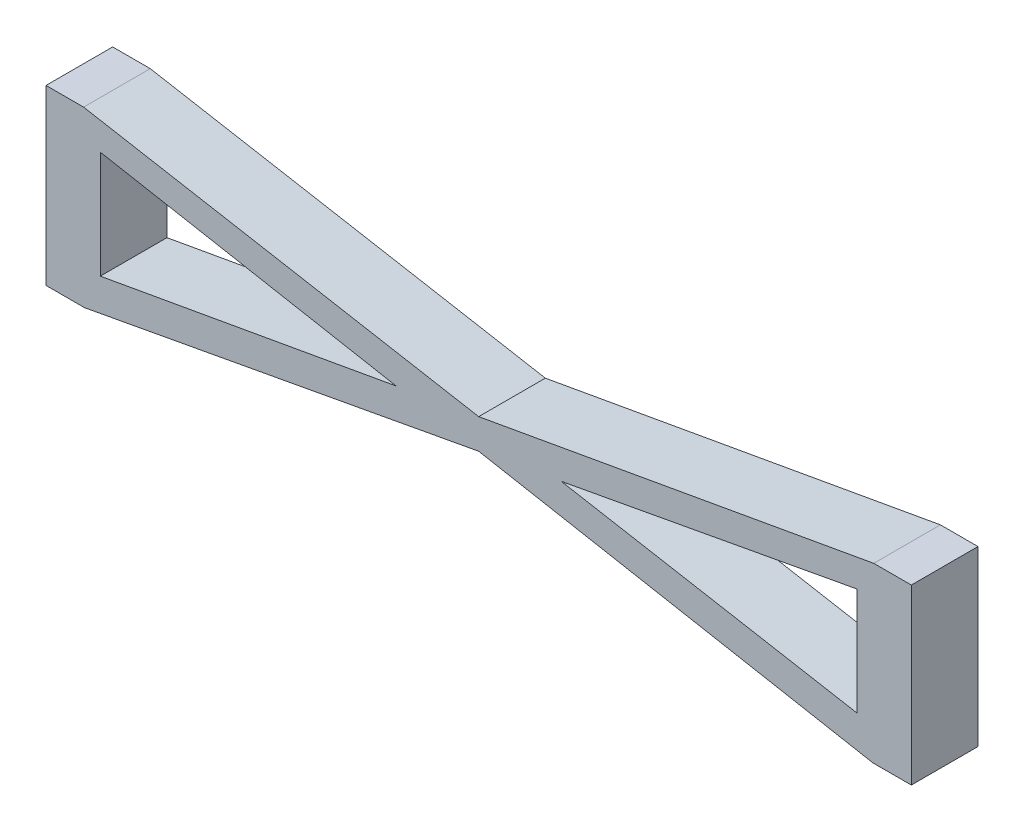
ISO-10303-21;
HEADER;
FILE_DESCRIPTION(('STEP AP214'),'2;1');
FILE_NAME('part.step','',(''),(''),'','','');
FILE_SCHEMA(('AUTOMOTIVE_DESIGN { 1 0 10303 214 1 1 1 1 }'));
ENDSEC;
DATA;
#1=APPLICATION_CONTEXT('core data for automotive mechanical design processes');
#2=APPLICATION_PROTOCOL_DEFINITION('international standard','automotive_design',2000,#1);
#3=PRODUCT_CONTEXT('',#1,'mechanical');
#4=PRODUCT('Part','Part','',(#3));
#5=PRODUCT_RELATED_PRODUCT_CATEGORY('part','',(#4));
#6=PRODUCT_DEFINITION_FORMATION('','',#4);
#7=PRODUCT_DEFINITION_CONTEXT('part definition',#1,'design');
#8=PRODUCT_DEFINITION('design','',#6,#7);
#9=PRODUCT_DEFINITION_SHAPE('','',#8);
#10=(LENGTH_UNIT() NAMED_UNIT(*) SI_UNIT(.MILLI.,.METRE.));
#11=(NAMED_UNIT(*) PLANE_ANGLE_UNIT() SI_UNIT($,.RADIAN.));
#12=(NAMED_UNIT(*) SI_UNIT($,.STERADIAN.) SOLID_ANGLE_UNIT());
#13=UNCERTAINTY_MEASURE_WITH_UNIT(LENGTH_MEASURE(1.E-05),#10,'distance_accuracy_value','');
#14=(GEOMETRIC_REPRESENTATION_CONTEXT(3) GLOBAL_UNCERTAINTY_ASSIGNED_CONTEXT((#13)) GLOBAL_UNIT_ASSIGNED_CONTEXT((#10,
#11,#12)) REPRESENTATION_CONTEXT('',''));
#15=CARTESIAN_POINT('',(0.,0.,0.));
#16=DIRECTION('',(0.,0.,1.));
#17=DIRECTION('',(1.,0.,0.));
#18=AXIS2_PLACEMENT_3D('',#15,#16,#17);
#19=CARTESIAN_POINT('',(0.,0.,19.0272625));
#20=DIRECTION('',(0.,0.,-1.));
#21=DIRECTION('',(-1.,0.,0.));
#22=AXIS2_PLACEMENT_3D('',#19,#20,#21);
#23=PLANE('',#22);
#24=DIRECTION('',(0.984447907206048,0.175676742904779,0.));
#25=VECTOR('',#24,1.);
#26=CARTESIAN_POINT('',(99.9298920153493,25.1202753574179,19.0272625));
#27=LINE('',#26,#25);
#28=CARTESIAN_POINT('',(15.5,10.0535884108689,19.0272625));
#29=VERTEX_POINT('',#28);
#30=CARTESIAN_POINT('',(99.9298920153493,25.1202753574179,19.0272625));
#31=VERTEX_POINT('',#30);
#32=EDGE_CURVE('E173',#29,#31,#27,.T.);
#33=ORIENTED_EDGE('',*,*,#32,.F.);
#34=DIRECTION('',(0.,-1.,0.));
#35=VECTOR('',#34,1.);
#36=CARTESIAN_POINT('',(15.5,10.0535884108689,19.0272625));
#37=LINE('',#36,#35);
#38=CARTESIAN_POINT('',(15.5,40.7056712671806,19.0272625));
#39=VERTEX_POINT('',#38);
#40=EDGE_CURVE('E179',#39,#29,#37,.T.);
#41=ORIENTED_EDGE('',*,*,#40,.F.);
#42=DIRECTION('',(-0.98338563427124,0.181528769920777,0.));
#43=VECTOR('',#42,1.);
#44=CARTESIAN_POINT('',(15.5,40.7056712671806,19.0272625));
#45=LINE('',#44,#43);
#46=EDGE_CURVE('E175',#31,#39,#45,.T.);
#47=ORIENTED_EDGE('',*,*,#46,.F.);
#48=EDGE_LOOP('',(#33,#41,#47));
#49=FACE_BOUND('',#48,.T.);
#50=DIRECTION('',(0.,-1.,0.));
#51=VECTOR('',#50,1.);
#52=CARTESIAN_POINT('',(0.,0.,19.0272625));
#53=LINE('',#52,#51);
#54=CARTESIAN_POINT('',(0.,49.45,19.0272625));
#55=VERTEX_POINT('',#54);
#56=CARTESIAN_POINT('',(0.,0.,19.0272625));
#57=VERTEX_POINT('',#56);
#58=EDGE_CURVE('E197',#55,#57,#53,.T.);
#59=ORIENTED_EDGE('',*,*,#58,.T.);
#60=DIRECTION('',(1.,0.,0.));
#61=VECTOR('',#60,1.);
#62=CARTESIAN_POINT('',(0.,0.,19.0272625));
#63=LINE('',#62,#61);
#64=CARTESIAN_POINT('',(10.9854067749023,0.,19.0272625));
#65=VERTEX_POINT('',#64);
#66=EDGE_CURVE('E200',#57,#65,#63,.T.);
#67=ORIENTED_EDGE('',*,*,#66,.T.);
#68=DIRECTION('',(0.98338563427124,0.181528769920777,0.));
#69=VECTOR('',#68,1.);
#70=CARTESIAN_POINT('',(123.4989795,20.7695229057467,19.0272625));
#71=LINE('',#70,#69);
#72=CARTESIAN_POINT('',(123.4989795,20.7695229057467,19.0272625));
#73=VERTEX_POINT('',#72);
#74=EDGE_CURVE('E203',#65,#73,#71,.T.);
#75=ORIENTED_EDGE('',*,*,#74,.T.);
#76=DIRECTION('',(0.98338563427124,-0.181528769920776,0.));
#77=VECTOR('',#76,1.);
#78=CARTESIAN_POINT('',(123.4989795,20.7695229057467,19.0272625));
#79=LINE('',#78,#77);
#80=CARTESIAN_POINT('',(236.012552225098,0.,19.0272625));
#81=VERTEX_POINT('',#80);
#82=EDGE_CURVE('E205',#73,#81,#79,.T.);
#83=ORIENTED_EDGE('',*,*,#82,.T.);
#84=DIRECTION('',(1.,0.,0.));
#85=VECTOR('',#84,1.);
#86=CARTESIAN_POINT('',(236.012552225098,0.,19.0272625));
#87=LINE('',#86,#85);
#88=CARTESIAN_POINT('',(246.997959,0.,19.0272625));
#89=VERTEX_POINT('',#88);
#90=EDGE_CURVE('E207',#81,#89,#87,.T.);
#91=ORIENTED_EDGE('',*,*,#90,.T.);
#92=DIRECTION('',(0.,1.,0.));
#93=VECTOR('',#92,1.);
#94=CARTESIAN_POINT('',(246.997959,0.,19.0272625));
#95=LINE('',#94,#93);
#96=CARTESIAN_POINT('',(246.997959,49.45,19.0272625));
#97=VERTEX_POINT('',#96);
#98=EDGE_CURVE('E209',#89,#97,#95,.T.);
#99=ORIENTED_EDGE('',*,*,#98,.T.);
#100=DIRECTION('',(-1.,0.,0.));
#101=VECTOR('',#100,1.);
#102=CARTESIAN_POINT('',(236.267497729452,49.45,19.0272625));
#103=LINE('',#102,#101);
#104=CARTESIAN_POINT('',(236.267497729452,49.45,19.0272625));
#105=VERTEX_POINT('',#104);
#106=EDGE_CURVE('E211',#97,#105,#103,.T.);
#107=ORIENTED_EDGE('',*,*,#106,.T.);
#108=DIRECTION('',(-0.984447907206048,-0.175676742904779,0.));
#109=VECTOR('',#108,1.);
#110=CARTESIAN_POINT('',(236.267497729452,49.45,19.0272625));
#111=LINE('',#110,#109);
#112=CARTESIAN_POINT('',(123.4989795,29.3262272338279,19.0272625));
#113=VERTEX_POINT('',#112);
#114=EDGE_CURVE('E213',#105,#113,#111,.T.);
#115=ORIENTED_EDGE('',*,*,#114,.T.);
#116=DIRECTION('',(-0.984447907206048,0.175676742904778,0.));
#117=VECTOR('',#116,1.);
#118=CARTESIAN_POINT('',(10.7304612705484,49.45,19.0272625));
#119=LINE('',#118,#117);
#120=CARTESIAN_POINT('',(10.7304612705484,49.45,19.0272625));
#121=VERTEX_POINT('',#120);
#122=EDGE_CURVE('E215',#113,#121,#119,.T.);
#123=ORIENTED_EDGE('',*,*,#122,.T.);
#124=DIRECTION('',(-1.,0.,0.));
#125=VECTOR('',#124,1.);
#126=CARTESIAN_POINT('',(0.,49.45,19.0272625));
#127=LINE('',#126,#125);
#128=EDGE_CURVE('E217',#121,#55,#127,.T.);
#129=ORIENTED_EDGE('',*,*,#128,.T.);
#130=EDGE_LOOP('',(#59,#67,#75,#83,#91,#99,#107,#115,#123,#129));
#131=FACE_BOUND('',#130,.T.);
#132=DIRECTION('',(0.984447907206048,-0.175676742904778,0.));
#133=VECTOR('',#132,1.);
#134=CARTESIAN_POINT('',(147.06806698465,25.1202753574179,19.0272625));
#135=LINE('',#134,#133);
#136=CARTESIAN_POINT('',(147.06806698465,25.1202753574179,19.0272625));
#137=VERTEX_POINT('',#136);
#138=CARTESIAN_POINT('',(231.497959,10.0535884108689,19.0272625));
#139=VERTEX_POINT('',#138);
#140=EDGE_CURVE('E146',#137,#139,#135,.T.);
#141=ORIENTED_EDGE('',*,*,#140,.F.);
#142=DIRECTION('',(-0.983385634271241,-0.181528769920776,0.));
#143=VECTOR('',#142,1.);
#144=CARTESIAN_POINT('',(231.497959,40.7056712671806,19.0272625));
#145=LINE('',#144,#143);
#146=CARTESIAN_POINT('',(231.497959,40.7056712671806,19.0272625));
#147=VERTEX_POINT('',#146);
#148=EDGE_CURVE('E163',#147,#137,#145,.T.);
#149=ORIENTED_EDGE('',*,*,#148,.F.);
#150=DIRECTION('',(0.,1.,0.));
#151=VECTOR('',#150,1.);
#152=CARTESIAN_POINT('',(231.497959,10.0535884108689,19.0272625));
#153=LINE('',#152,#151);
#154=EDGE_CURVE('E154',#139,#147,#153,.T.);
#155=ORIENTED_EDGE('',*,*,#154,.F.);
#156=EDGE_LOOP('',(#141,#149,#155));
#157=FACE_BOUND('',#156,.T.);
#158=ADVANCED_FACE('F33',(#49,#131,#157),#23,.F.);
#159=CARTESIAN_POINT('',(0.,0.,0.));
#160=DIRECTION('',(0.,0.,-1.));
#161=DIRECTION('',(-1.,0.,0.));
#162=AXIS2_PLACEMENT_3D('',#159,#160,#161);
#163=PLANE('',#162);
#164=DIRECTION('',(0.,-1.,0.));
#165=VECTOR('',#164,1.);
#166=CARTESIAN_POINT('',(0.,0.,0.));
#167=LINE('',#166,#165);
#168=CARTESIAN_POINT('',(0.,49.45,0.));
#169=VERTEX_POINT('',#168);
#170=CARTESIAN_POINT('',(0.,0.,0.));
#171=VERTEX_POINT('',#170);
#172=EDGE_CURVE('E196',#169,#171,#167,.T.);
#173=ORIENTED_EDGE('',*,*,#172,.F.);
#174=DIRECTION('',(-1.,0.,0.));
#175=VECTOR('',#174,1.);
#176=CARTESIAN_POINT('',(0.,49.45,0.));
#177=LINE('',#176,#175);
#178=CARTESIAN_POINT('',(10.7304612705484,49.45,0.));
#179=VERTEX_POINT('',#178);
#180=EDGE_CURVE('E201',#179,#169,#177,.T.);
#181=ORIENTED_EDGE('',*,*,#180,.F.);
#182=DIRECTION('',(-0.984447907206048,0.175676742904778,0.));
#183=VECTOR('',#182,1.);
#184=CARTESIAN_POINT('',(10.7304612705484,49.45,0.));
#185=LINE('',#184,#183);
#186=CARTESIAN_POINT('',(123.4989795,29.3262272338279,0.));
#187=VERTEX_POINT('',#186);
#188=EDGE_CURVE('E236',#187,#179,#185,.T.);
#189=ORIENTED_EDGE('',*,*,#188,.F.);
#190=DIRECTION('',(-0.984447907206048,-0.175676742904779,0.));
#191=VECTOR('',#190,1.);
#192=CARTESIAN_POINT('',(236.267497729452,49.45,0.));
#193=LINE('',#192,#191);
#194=CARTESIAN_POINT('',(236.267497729452,49.45,0.));
#195=VERTEX_POINT('',#194);
#196=EDGE_CURVE('E234',#195,#187,#193,.T.);
#197=ORIENTED_EDGE('',*,*,#196,.F.);
#198=DIRECTION('',(-1.,0.,0.));
#199=VECTOR('',#198,1.);
#200=CARTESIAN_POINT('',(236.267497729452,49.45,0.));
#201=LINE('',#200,#199);
#202=CARTESIAN_POINT('',(246.997959,49.45,0.));
#203=VERTEX_POINT('',#202);
#204=EDGE_CURVE('E232',#203,#195,#201,.T.);
#205=ORIENTED_EDGE('',*,*,#204,.F.);
#206=DIRECTION('',(0.,1.,0.));
#207=VECTOR('',#206,1.);
#208=CARTESIAN_POINT('',(246.997959,0.,0.));
#209=LINE('',#208,#207);
#210=CARTESIAN_POINT('',(246.997959,0.,0.));
#211=VERTEX_POINT('',#210);
#212=EDGE_CURVE('E230',#211,#203,#209,.T.);
#213=ORIENTED_EDGE('',*,*,#212,.F.);
#214=DIRECTION('',(1.,0.,0.));
#215=VECTOR('',#214,1.);
#216=CARTESIAN_POINT('',(236.012552225098,0.,0.));
#217=LINE('',#216,#215);
#218=CARTESIAN_POINT('',(236.012552225098,0.,0.));
#219=VERTEX_POINT('',#218);
#220=EDGE_CURVE('E228',#219,#211,#217,.T.);
#221=ORIENTED_EDGE('',*,*,#220,.F.);
#222=DIRECTION('',(0.98338563427124,-0.181528769920776,0.));
#223=VECTOR('',#222,1.);
#224=CARTESIAN_POINT('',(123.4989795,20.7695229057467,0.));
#225=LINE('',#224,#223);
#226=CARTESIAN_POINT('',(123.4989795,20.7695229057467,0.));
#227=VERTEX_POINT('',#226);
#228=EDGE_CURVE('E226',#227,#219,#225,.T.);
#229=ORIENTED_EDGE('',*,*,#228,.F.);
#230=DIRECTION('',(0.98338563427124,0.181528769920777,0.));
#231=VECTOR('',#230,1.);
#232=CARTESIAN_POINT('',(123.4989795,20.7695229057467,0.));
#233=LINE('',#232,#231);
#234=CARTESIAN_POINT('',(10.9854067749023,0.,0.));
#235=VERTEX_POINT('',#234);
#236=EDGE_CURVE('E224',#235,#227,#233,.T.);
#237=ORIENTED_EDGE('',*,*,#236,.F.);
#238=DIRECTION('',(1.,0.,0.));
#239=VECTOR('',#238,1.);
#240=CARTESIAN_POINT('',(0.,0.,0.));
#241=LINE('',#240,#239);
#242=EDGE_CURVE('E222',#171,#235,#241,.T.);
#243=ORIENTED_EDGE('',*,*,#242,.F.);
#244=EDGE_LOOP('',(#173,#181,#189,#197,#205,#213,#221,#229,#237,#243));
#245=FACE_BOUND('',#244,.T.);
#246=DIRECTION('',(0.,-1.,0.));
#247=VECTOR('',#246,1.);
#248=CARTESIAN_POINT('',(15.5,10.0535884108689,0.));
#249=LINE('',#248,#247);
#250=CARTESIAN_POINT('',(15.5,40.7056712671806,0.));
#251=VERTEX_POINT('',#250);
#252=CARTESIAN_POINT('',(15.5,10.0535884108689,0.));
#253=VERTEX_POINT('',#252);
#254=EDGE_CURVE('E176',#251,#253,#249,.T.);
#255=ORIENTED_EDGE('',*,*,#254,.T.);
#256=DIRECTION('',(0.984447907206048,0.175676742904779,0.));
#257=VECTOR('',#256,1.);
#258=CARTESIAN_POINT('',(99.9298920153493,25.1202753574179,0.));
#259=LINE('',#258,#257);
#260=CARTESIAN_POINT('',(99.9298920153493,25.1202753574179,0.));
#261=VERTEX_POINT('',#260);
#262=EDGE_CURVE('E161',#253,#261,#259,.T.);
#263=ORIENTED_EDGE('',*,*,#262,.T.);
#264=DIRECTION('',(-0.98338563427124,0.181528769920777,0.));
#265=VECTOR('',#264,1.);
#266=CARTESIAN_POINT('',(15.5,40.7056712671806,0.));
#267=LINE('',#266,#265);
#268=EDGE_CURVE('E184',#261,#251,#267,.T.);
#269=ORIENTED_EDGE('',*,*,#268,.T.);
#270=EDGE_LOOP('',(#255,#263,#269));
#271=FACE_BOUND('',#270,.T.);
#272=DIRECTION('',(-0.983385634271241,-0.181528769920776,0.));
#273=VECTOR('',#272,1.);
#274=CARTESIAN_POINT('',(231.497959,40.7056712671806,0.));
#275=LINE('',#274,#273);
#276=CARTESIAN_POINT('',(231.497959,40.7056712671806,0.));
#277=VERTEX_POINT('',#276);
#278=CARTESIAN_POINT('',(147.06806698465,25.1202753574179,0.));
#279=VERTEX_POINT('',#278);
#280=EDGE_CURVE('E155',#277,#279,#275,.T.);
#281=ORIENTED_EDGE('',*,*,#280,.T.);
#282=DIRECTION('',(0.984447907206048,-0.175676742904778,0.));
#283=VECTOR('',#282,1.);
#284=CARTESIAN_POINT('',(147.06806698465,25.1202753574179,0.));
#285=LINE('',#284,#283);
#286=CARTESIAN_POINT('',(231.497959,10.0535884108689,0.));
#287=VERTEX_POINT('',#286);
#288=EDGE_CURVE('E56',#279,#287,#285,.T.);
#289=ORIENTED_EDGE('',*,*,#288,.T.);
#290=DIRECTION('',(0.,1.,0.));
#291=VECTOR('',#290,1.);
#292=CARTESIAN_POINT('',(231.497959,10.0535884108689,0.));
#293=LINE('',#292,#291);
#294=EDGE_CURVE('E160',#287,#277,#293,.T.);
#295=ORIENTED_EDGE('',*,*,#294,.T.);
#296=EDGE_LOOP('',(#281,#289,#295));
#297=FACE_BOUND('',#296,.T.);
#298=ADVANCED_FACE('F272',(#245,#271,#297),#163,.T.);
#299=CARTESIAN_POINT('',(0.,0.,19.0272625));
#300=DIRECTION('',(1.,0.,0.));
#301=DIRECTION('',(0.,0.,-1.));
#302=AXIS2_PLACEMENT_3D('',#299,#300,#301);
#303=PLANE('',#302);
#304=ORIENTED_EDGE('',*,*,#172,.T.);
#305=DIRECTION('',(0.,0.,-1.));
#306=VECTOR('',#305,1.);
#307=CARTESIAN_POINT('',(0.,0.,19.0272625));
#308=LINE('',#307,#306);
#309=EDGE_CURVE('E11',#57,#171,#308,.T.);
#310=ORIENTED_EDGE('',*,*,#309,.F.);
#311=ORIENTED_EDGE('',*,*,#58,.F.);
#312=DIRECTION('',(0.,0.,-1.));
#313=VECTOR('',#312,1.);
#314=CARTESIAN_POINT('',(0.,49.45,19.0272625));
#315=LINE('',#314,#313);
#316=EDGE_CURVE('E219',#55,#169,#315,.T.);
#317=ORIENTED_EDGE('',*,*,#316,.T.);
#318=EDGE_LOOP('',(#304,#310,#311,#317));
#319=FACE_BOUND('',#318,.T.);
#320=ADVANCED_FACE('F35',(#319),#303,.F.);
#321=CARTESIAN_POINT('',(0.,0.,19.0272625));
#322=DIRECTION('',(0.,1.,0.));
#323=DIRECTION('',(0.,0.,1.));
#324=AXIS2_PLACEMENT_3D('',#321,#322,#323);
#325=PLANE('',#324);
#326=ORIENTED_EDGE('',*,*,#242,.T.);
#327=DIRECTION('',(0.,0.,-1.));
#328=VECTOR('',#327,1.);
#329=CARTESIAN_POINT('',(10.9854067749023,0.,19.0272625));
#330=LINE('',#329,#328);
#331=EDGE_CURVE('E41',#65,#235,#330,.T.);
#332=ORIENTED_EDGE('',*,*,#331,.F.);
#333=ORIENTED_EDGE('',*,*,#66,.F.);
#334=ORIENTED_EDGE('',*,*,#309,.T.);
#335=EDGE_LOOP('',(#326,#332,#333,#334));
#336=FACE_BOUND('',#335,.T.);
#337=ADVANCED_FACE('F289',(#336),#325,.F.);
#338=CARTESIAN_POINT('',(123.4989795,20.7695229057467,19.0272625));
#339=DIRECTION('',(-0.181528769920777,0.98338563427124,0.));
#340=DIRECTION('',(-0.98338563427124,-0.181528769920777,0.));
#341=AXIS2_PLACEMENT_3D('',#338,#339,#340);
#342=PLANE('',#341);
#343=ORIENTED_EDGE('',*,*,#236,.T.);
#344=DIRECTION('',(0.,0.,-1.));
#345=VECTOR('',#344,1.);
#346=CARTESIAN_POINT('',(123.4989795,20.7695229057467,19.0272625));
#347=LINE('',#346,#345);
#348=EDGE_CURVE('E259',#73,#227,#347,.T.);
#349=ORIENTED_EDGE('',*,*,#348,.F.);
#350=ORIENTED_EDGE('',*,*,#74,.F.);
#351=ORIENTED_EDGE('',*,*,#331,.T.);
#352=EDGE_LOOP('',(#343,#349,#350,#351));
#353=FACE_BOUND('',#352,.T.);
#354=ADVANCED_FACE('F266',(#353),#342,.F.);
#355=CARTESIAN_POINT('',(123.4989795,20.7695229057467,19.0272625));
#356=DIRECTION('',(0.181528769920776,0.98338563427124,0.));
#357=DIRECTION('',(-0.983385634271241,0.181528769920776,0.));
#358=AXIS2_PLACEMENT_3D('',#355,#356,#357);
#359=PLANE('',#358);
#360=ORIENTED_EDGE('',*,*,#228,.T.);
#361=DIRECTION('',(0.,0.,-1.));
#362=VECTOR('',#361,1.);
#363=CARTESIAN_POINT('',(236.012552225098,0.,19.0272625));
#364=LINE('',#363,#362);
#365=EDGE_CURVE('E256',#81,#219,#364,.T.);
#366=ORIENTED_EDGE('',*,*,#365,.F.);
#367=ORIENTED_EDGE('',*,*,#82,.F.);
#368=ORIENTED_EDGE('',*,*,#348,.T.);
#369=EDGE_LOOP('',(#360,#366,#367,#368));
#370=FACE_BOUND('',#369,.T.);
#371=ADVANCED_FACE('F278',(#370),#359,.F.);
#372=CARTESIAN_POINT('',(236.012552225098,0.,19.0272625));
#373=DIRECTION('',(0.,1.,0.));
#374=DIRECTION('',(0.,0.,1.));
#375=AXIS2_PLACEMENT_3D('',#372,#373,#374);
#376=PLANE('',#375);
#377=ORIENTED_EDGE('',*,*,#220,.T.);
#378=DIRECTION('',(0.,0.,-1.));
#379=VECTOR('',#378,1.);
#380=CARTESIAN_POINT('',(246.997959,0.,19.0272625));
#381=LINE('',#380,#379);
#382=EDGE_CURVE('E253',#89,#211,#381,.T.);
#383=ORIENTED_EDGE('',*,*,#382,.F.);
#384=ORIENTED_EDGE('',*,*,#90,.F.);
#385=ORIENTED_EDGE('',*,*,#365,.T.);
#386=EDGE_LOOP('',(#377,#383,#384,#385));
#387=FACE_BOUND('',#386,.T.);
#388=ADVANCED_FACE('F282',(#387),#376,.F.);
#389=CARTESIAN_POINT('',(246.997959,0.,19.0272625));
#390=DIRECTION('',(-1.,0.,0.));
#391=DIRECTION('',(0.,0.,1.));
#392=AXIS2_PLACEMENT_3D('',#389,#390,#391);
#393=PLANE('',#392);
#394=ORIENTED_EDGE('',*,*,#212,.T.);
#395=DIRECTION('',(0.,0.,-1.));
#396=VECTOR('',#395,1.);
#397=CARTESIAN_POINT('',(246.997959,49.45,19.0272625));
#398=LINE('',#397,#396);
#399=EDGE_CURVE('E250',#97,#203,#398,.T.);
#400=ORIENTED_EDGE('',*,*,#399,.F.);
#401=ORIENTED_EDGE('',*,*,#98,.F.);
#402=ORIENTED_EDGE('',*,*,#382,.T.);
#403=EDGE_LOOP('',(#394,#400,#401,#402));
#404=FACE_BOUND('',#403,.T.);
#405=ADVANCED_FACE('F312',(#404),#393,.F.);
#406=CARTESIAN_POINT('',(236.267497729452,49.45,19.0272625));
#407=DIRECTION('',(0.,-1.,0.));
#408=DIRECTION('',(0.,0.,-1.));
#409=AXIS2_PLACEMENT_3D('',#406,#407,#408);
#410=PLANE('',#409);
#411=ORIENTED_EDGE('',*,*,#204,.T.);
#412=DIRECTION('',(0.,0.,-1.));
#413=VECTOR('',#412,1.);
#414=CARTESIAN_POINT('',(236.267497729452,49.45,19.0272625));
#415=LINE('',#414,#413);
#416=EDGE_CURVE('E247',#105,#195,#415,.T.);
#417=ORIENTED_EDGE('',*,*,#416,.F.);
#418=ORIENTED_EDGE('',*,*,#106,.F.);
#419=ORIENTED_EDGE('',*,*,#399,.T.);
#420=EDGE_LOOP('',(#411,#417,#418,#419));
#421=FACE_BOUND('',#420,.T.);
#422=ADVANCED_FACE('F309',(#421),#410,.F.);
#423=CARTESIAN_POINT('',(236.267497729452,49.45,19.0272625));
#424=DIRECTION('',(0.175676742904779,-0.984447907206048,0.));
#425=DIRECTION('',(0.984447907206048,0.175676742904779,0.));
#426=AXIS2_PLACEMENT_3D('',#423,#424,#425);
#427=PLANE('',#426);
#428=ORIENTED_EDGE('',*,*,#196,.T.);
#429=DIRECTION('',(0.,0.,-1.));
#430=VECTOR('',#429,1.);
#431=CARTESIAN_POINT('',(123.4989795,29.3262272338279,19.0272625));
#432=LINE('',#431,#430);
#433=EDGE_CURVE('E244',#113,#187,#432,.T.);
#434=ORIENTED_EDGE('',*,*,#433,.F.);
#435=ORIENTED_EDGE('',*,*,#114,.F.);
#436=ORIENTED_EDGE('',*,*,#416,.T.);
#437=EDGE_LOOP('',(#428,#434,#435,#436));
#438=FACE_BOUND('',#437,.T.);
#439=ADVANCED_FACE('F305',(#438),#427,.F.);
#440=CARTESIAN_POINT('',(10.7304612705484,49.45,19.0272625));
#441=DIRECTION('',(-0.175676742904778,-0.984447907206048,0.));
#442=DIRECTION('',(0.984447907206049,-0.175676742904778,0.));
#443=AXIS2_PLACEMENT_3D('',#440,#441,#442);
#444=PLANE('',#443);
#445=ORIENTED_EDGE('',*,*,#188,.T.);
#446=DIRECTION('',(0.,0.,-1.));
#447=VECTOR('',#446,1.);
#448=CARTESIAN_POINT('',(10.7304612705484,49.45,19.0272625));
#449=LINE('',#448,#447);
#450=EDGE_CURVE('E241',#121,#179,#449,.T.);
#451=ORIENTED_EDGE('',*,*,#450,.F.);
#452=ORIENTED_EDGE('',*,*,#122,.F.);
#453=ORIENTED_EDGE('',*,*,#433,.T.);
#454=EDGE_LOOP('',(#445,#451,#452,#453));
#455=FACE_BOUND('',#454,.T.);
#456=ADVANCED_FACE('F301',(#455),#444,.F.);
#457=CARTESIAN_POINT('',(0.,49.45,19.0272625));
#458=DIRECTION('',(0.,-1.,0.));
#459=DIRECTION('',(0.,0.,-1.));
#460=AXIS2_PLACEMENT_3D('',#457,#458,#459);
#461=PLANE('',#460);
#462=ORIENTED_EDGE('',*,*,#180,.T.);
#463=ORIENTED_EDGE('',*,*,#316,.F.);
#464=ORIENTED_EDGE('',*,*,#128,.F.);
#465=ORIENTED_EDGE('',*,*,#450,.T.);
#466=EDGE_LOOP('',(#462,#463,#464,#465));
#467=FACE_BOUND('',#466,.T.);
#468=ADVANCED_FACE('F296',(#467),#461,.F.);
#469=CARTESIAN_POINT('',(99.9298920153493,25.1202753574179,19.0272625));
#470=DIRECTION('',(-0.175676742904779,0.984447907206048,0.));
#471=DIRECTION('',(-0.984447907206048,-0.175676742904779,0.));
#472=AXIS2_PLACEMENT_3D('',#469,#470,#471);
#473=PLANE('',#472);
#474=ORIENTED_EDGE('',*,*,#262,.F.);
#475=DIRECTION('',(0.,0.,-1.));
#476=VECTOR('',#475,1.);
#477=CARTESIAN_POINT('',(15.5,10.0535884108689,19.0272625));
#478=LINE('',#477,#476);
#479=EDGE_CURVE('E181',#29,#253,#478,.T.);
#480=ORIENTED_EDGE('',*,*,#479,.F.);
#481=ORIENTED_EDGE('',*,*,#32,.T.);
#482=DIRECTION('',(0.,0.,-1.));
#483=VECTOR('',#482,1.);
#484=CARTESIAN_POINT('',(99.9298920153493,25.1202753574179,19.0272625));
#485=LINE('',#484,#483);
#486=EDGE_CURVE('E193',#31,#261,#485,.T.);
#487=ORIENTED_EDGE('',*,*,#486,.T.);
#488=EDGE_LOOP('',(#474,#480,#481,#487));
#489=FACE_BOUND('',#488,.T.);
#490=ADVANCED_FACE('F330',(#489),#473,.T.);
#491=CARTESIAN_POINT('',(15.5,40.7056712671806,19.0272625));
#492=DIRECTION('',(-0.181528769920777,-0.98338563427124,0.));
#493=DIRECTION('',(0.98338563427124,-0.181528769920777,0.));
#494=AXIS2_PLACEMENT_3D('',#491,#492,#493);
#495=PLANE('',#494);
#496=ORIENTED_EDGE('',*,*,#268,.F.);
#497=ORIENTED_EDGE('',*,*,#486,.F.);
#498=ORIENTED_EDGE('',*,*,#46,.T.);
#499=DIRECTION('',(0.,0.,-1.));
#500=VECTOR('',#499,1.);
#501=CARTESIAN_POINT('',(15.5,40.7056712671806,19.0272625));
#502=LINE('',#501,#500);
#503=EDGE_CURVE('E191',#39,#251,#502,.T.);
#504=ORIENTED_EDGE('',*,*,#503,.T.);
#505=EDGE_LOOP('',(#496,#497,#498,#504));
#506=FACE_BOUND('',#505,.T.);
#507=ADVANCED_FACE('F356',(#506),#495,.T.);
#508=CARTESIAN_POINT('',(15.5,10.0535884108689,19.0272625));
#509=DIRECTION('',(1.,0.,0.));
#510=DIRECTION('',(0.,1.,0.));
#511=AXIS2_PLACEMENT_3D('',#508,#509,#510);
#512=PLANE('',#511);
#513=ORIENTED_EDGE('',*,*,#254,.F.);
#514=ORIENTED_EDGE('',*,*,#503,.F.);
#515=ORIENTED_EDGE('',*,*,#40,.T.);
#516=ORIENTED_EDGE('',*,*,#479,.T.);
#517=EDGE_LOOP('',(#513,#514,#515,#516));
#518=FACE_BOUND('',#517,.T.);
#519=ADVANCED_FACE('F363',(#518),#512,.T.);
#520=CARTESIAN_POINT('',(147.06806698465,25.1202753574179,19.0272625));
#521=DIRECTION('',(0.175676742904778,0.984447907206048,0.));
#522=DIRECTION('',(-0.984447907206049,0.175676742904778,0.));
#523=AXIS2_PLACEMENT_3D('',#520,#521,#522);
#524=PLANE('',#523);
#525=ORIENTED_EDGE('',*,*,#288,.F.);
#526=DIRECTION('',(0.,0.,-1.));
#527=VECTOR('',#526,1.);
#528=CARTESIAN_POINT('',(147.06806698465,25.1202753574179,19.0272625));
#529=LINE('',#528,#527);
#530=EDGE_CURVE('E150',#137,#279,#529,.T.);
#531=ORIENTED_EDGE('',*,*,#530,.F.);
#532=ORIENTED_EDGE('',*,*,#140,.T.);
#533=DIRECTION('',(0.,0.,-1.));
#534=VECTOR('',#533,1.);
#535=CARTESIAN_POINT('',(231.497959,10.0535884108689,19.0272625));
#536=LINE('',#535,#534);
#537=EDGE_CURVE('E149',#139,#287,#536,.T.);
#538=ORIENTED_EDGE('',*,*,#537,.T.);
#539=EDGE_LOOP('',(#525,#531,#532,#538));
#540=FACE_BOUND('',#539,.T.);
#541=ADVANCED_FACE('F148',(#540),#524,.T.);
#542=CARTESIAN_POINT('',(231.497959,10.0535884108689,19.0272625));
#543=DIRECTION('',(-1.,0.,0.));
#544=DIRECTION('',(0.,-1.,0.));
#545=AXIS2_PLACEMENT_3D('',#542,#543,#544);
#546=PLANE('',#545);
#547=ORIENTED_EDGE('',*,*,#294,.F.);
#548=ORIENTED_EDGE('',*,*,#537,.F.);
#549=ORIENTED_EDGE('',*,*,#154,.T.);
#550=DIRECTION('',(0.,0.,-1.));
#551=VECTOR('',#550,1.);
#552=CARTESIAN_POINT('',(231.497959,40.7056712671806,19.0272625));
#553=LINE('',#552,#551);
#554=EDGE_CURVE('E48',#147,#277,#553,.T.);
#555=ORIENTED_EDGE('',*,*,#554,.T.);
#556=EDGE_LOOP('',(#547,#548,#549,#555));
#557=FACE_BOUND('',#556,.T.);
#558=ADVANCED_FACE('F158',(#557),#546,.T.);
#559=CARTESIAN_POINT('',(231.497959,40.7056712671806,19.0272625));
#560=DIRECTION('',(0.181528769920776,-0.98338563427124,0.));
#561=DIRECTION('',(0.98338563427124,0.181528769920776,0.));
#562=AXIS2_PLACEMENT_3D('',#559,#560,#561);
#563=PLANE('',#562);
#564=ORIENTED_EDGE('',*,*,#280,.F.);
#565=ORIENTED_EDGE('',*,*,#554,.F.);
#566=ORIENTED_EDGE('',*,*,#148,.T.);
#567=ORIENTED_EDGE('',*,*,#530,.T.);
#568=EDGE_LOOP('',(#564,#565,#566,#567));
#569=FACE_BOUND('',#568,.T.);
#570=ADVANCED_FACE('F383',(#569),#563,.T.);
#571=CLOSED_SHELL('',(#158,#298,#320,#337,#354,#371,#388,#405,#422,#439,#456,#468,#490,#507,
#519,#541,#558,#570));
#572=MANIFOLD_SOLID_BREP('B2',#571);
#573=ADVANCED_BREP_SHAPE_REPRESENTATION('',(#18,#572),#14);
#574=SHAPE_DEFINITION_REPRESENTATION(#9,#573);
ENDSEC;
END-ISO-10303-21;
